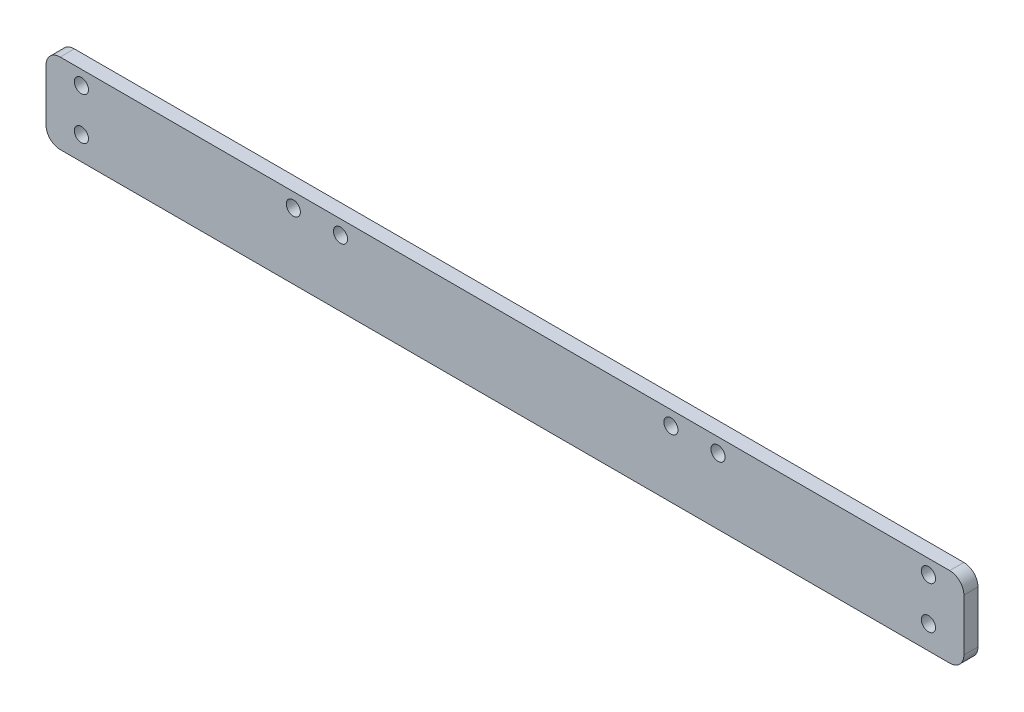
ISO-10303-21;
HEADER;
FILE_DESCRIPTION(('STEP AP214'),'2;1');
FILE_NAME('part.step','',(''),(''),'','','');
FILE_SCHEMA(('AUTOMOTIVE_DESIGN { 1 0 10303 214 1 1 1 1 }'));
ENDSEC;
DATA;
#1=APPLICATION_CONTEXT('core data for automotive mechanical design processes');
#2=APPLICATION_PROTOCOL_DEFINITION('international standard','automotive_design',2000,#1);
#3=PRODUCT_CONTEXT('',#1,'mechanical');
#4=PRODUCT('Part','Part','',(#3));
#5=PRODUCT_RELATED_PRODUCT_CATEGORY('part','',(#4));
#6=PRODUCT_DEFINITION_FORMATION('','',#4);
#7=PRODUCT_DEFINITION_CONTEXT('part definition',#1,'design');
#8=PRODUCT_DEFINITION('design','',#6,#7);
#9=PRODUCT_DEFINITION_SHAPE('','',#8);
#10=(LENGTH_UNIT() NAMED_UNIT(*) SI_UNIT(.MILLI.,.METRE.));
#11=(NAMED_UNIT(*) PLANE_ANGLE_UNIT() SI_UNIT($,.RADIAN.));
#12=(NAMED_UNIT(*) SI_UNIT($,.STERADIAN.) SOLID_ANGLE_UNIT());
#13=UNCERTAINTY_MEASURE_WITH_UNIT(LENGTH_MEASURE(1.E-05),#10,'distance_accuracy_value','');
#14=(GEOMETRIC_REPRESENTATION_CONTEXT(3) GLOBAL_UNCERTAINTY_ASSIGNED_CONTEXT((#13)) GLOBAL_UNIT_ASSIGNED_CONTEXT((#10,
#11,#12)) REPRESENTATION_CONTEXT('',''));
#15=CARTESIAN_POINT('',(0.,0.,0.));
#16=DIRECTION('',(0.,0.,1.));
#17=DIRECTION('',(1.,0.,0.));
#18=AXIS2_PLACEMENT_3D('',#15,#16,#17);
#19=CARTESIAN_POINT('',(97.3,-8.5,3.));
#20=DIRECTION('',(-1.,0.,0.));
#21=DIRECTION('',(0.,0.,1.));
#22=AXIS2_PLACEMENT_3D('',#19,#20,#21);
#23=PLANE('',#22);
#24=DIRECTION('',(0.,1.,0.));
#25=VECTOR('',#24,1.);
#26=CARTESIAN_POINT('',(97.3,-8.5,3.));
#27=LINE('',#26,#25);
#28=CARTESIAN_POINT('',(97.3,-5.5,3.));
#29=VERTEX_POINT('',#28);
#30=CARTESIAN_POINT('',(97.3,5.50000000000001,3.));
#31=VERTEX_POINT('',#30);
#32=EDGE_CURVE('E127',#29,#31,#27,.T.);
#33=ORIENTED_EDGE('',*,*,#32,.F.);
#34=DIRECTION('',(0.,0.,-1.));
#35=VECTOR('',#34,1.);
#36=CARTESIAN_POINT('',(97.3,-5.5,3.));
#37=LINE('',#36,#35);
#38=CARTESIAN_POINT('',(97.3,-5.5,0.));
#39=VERTEX_POINT('',#38);
#40=EDGE_CURVE('E112',#29,#39,#37,.T.);
#41=ORIENTED_EDGE('',*,*,#40,.T.);
#42=DIRECTION('',(0.,1.,0.));
#43=VECTOR('',#42,1.);
#44=CARTESIAN_POINT('',(97.3,-8.5,0.));
#45=LINE('',#44,#43);
#46=CARTESIAN_POINT('',(97.3,5.50000000000001,0.));
#47=VERTEX_POINT('',#46);
#48=EDGE_CURVE('E124',#39,#47,#45,.T.);
#49=ORIENTED_EDGE('',*,*,#48,.T.);
#50=DIRECTION('',(0.,0.,-1.));
#51=VECTOR('',#50,1.);
#52=CARTESIAN_POINT('',(97.3,5.50000000000001,3.));
#53=LINE('',#52,#51);
#54=EDGE_CURVE('E129',#47,#31,#53,.F.);
#55=ORIENTED_EDGE('',*,*,#54,.T.);
#56=EDGE_LOOP('',(#33,#41,#49,#55));
#57=FACE_BOUND('',#56,.T.);
#58=ADVANCED_FACE('F43',(#57),#23,.F.);
#59=CARTESIAN_POINT('',(-97.3,8.5,3.));
#60=DIRECTION('',(0.,-1.,0.));
#61=DIRECTION('',(0.,0.,-1.));
#62=AXIS2_PLACEMENT_3D('',#59,#60,#61);
#63=PLANE('',#62);
#64=DIRECTION('',(-1.,0.,0.));
#65=VECTOR('',#64,1.);
#66=CARTESIAN_POINT('',(-97.3,8.5,3.));
#67=LINE('',#66,#65);
#68=CARTESIAN_POINT('',(94.3,8.5,3.));
#69=VERTEX_POINT('',#68);
#70=CARTESIAN_POINT('',(-94.3,8.5,3.));
#71=VERTEX_POINT('',#70);
#72=EDGE_CURVE('E182',#69,#71,#67,.T.);
#73=ORIENTED_EDGE('',*,*,#72,.F.);
#74=DIRECTION('',(0.,0.,-1.));
#75=VECTOR('',#74,1.);
#76=CARTESIAN_POINT('',(94.3,8.5,3.));
#77=LINE('',#76,#75);
#78=CARTESIAN_POINT('',(94.3,8.5,0.));
#79=VERTEX_POINT('',#78);
#80=EDGE_CURVE('E166',#69,#79,#77,.T.);
#81=ORIENTED_EDGE('',*,*,#80,.T.);
#82=DIRECTION('',(-1.,0.,0.));
#83=VECTOR('',#82,1.);
#84=CARTESIAN_POINT('',(-97.3,8.5,0.));
#85=LINE('',#84,#83);
#86=CARTESIAN_POINT('',(-94.3,8.5,0.));
#87=VERTEX_POINT('',#86);
#88=EDGE_CURVE('E133',#79,#87,#85,.T.);
#89=ORIENTED_EDGE('',*,*,#88,.T.);
#90=DIRECTION('',(0.,0.,-1.));
#91=VECTOR('',#90,1.);
#92=CARTESIAN_POINT('',(-94.3,8.5,3.));
#93=LINE('',#92,#91);
#94=EDGE_CURVE('E164',#87,#71,#93,.F.);
#95=ORIENTED_EDGE('',*,*,#94,.T.);
#96=EDGE_LOOP('',(#73,#81,#89,#95));
#97=FACE_BOUND('',#96,.T.);
#98=ADVANCED_FACE('F273',(#97),#63,.F.);
#99=CARTESIAN_POINT('',(-97.3,-8.5,3.));
#100=DIRECTION('',(1.,0.,0.));
#101=DIRECTION('',(0.,0.,-1.));
#102=AXIS2_PLACEMENT_3D('',#99,#100,#101);
#103=PLANE('',#102);
#104=DIRECTION('',(0.,-1.,0.));
#105=VECTOR('',#104,1.);
#106=CARTESIAN_POINT('',(-97.3,-8.5,0.));
#107=LINE('',#106,#105);
#108=CARTESIAN_POINT('',(-97.3,5.50000000000001,0.));
#109=VERTEX_POINT('',#108);
#110=CARTESIAN_POINT('',(-97.3,-5.5,0.));
#111=VERTEX_POINT('',#110);
#112=EDGE_CURVE('E137',#109,#111,#107,.T.);
#113=ORIENTED_EDGE('',*,*,#112,.T.);
#114=DIRECTION('',(0.,0.,-1.));
#115=VECTOR('',#114,1.);
#116=CARTESIAN_POINT('',(-97.3,-5.5,3.));
#117=LINE('',#116,#115);
#118=CARTESIAN_POINT('',(-97.3,-5.5,3.));
#119=VERTEX_POINT('',#118);
#120=EDGE_CURVE('E11',#111,#119,#117,.F.);
#121=ORIENTED_EDGE('',*,*,#120,.T.);
#122=DIRECTION('',(0.,-1.,0.));
#123=VECTOR('',#122,1.);
#124=CARTESIAN_POINT('',(-97.3,-8.5,3.));
#125=LINE('',#124,#123);
#126=CARTESIAN_POINT('',(-97.3,5.50000000000001,3.));
#127=VERTEX_POINT('',#126);
#128=EDGE_CURVE('E172',#127,#119,#125,.T.);
#129=ORIENTED_EDGE('',*,*,#128,.F.);
#130=DIRECTION('',(0.,0.,-1.));
#131=VECTOR('',#130,1.);
#132=CARTESIAN_POINT('',(-97.3,5.50000000000001,3.));
#133=LINE('',#132,#131);
#134=EDGE_CURVE('E51',#127,#109,#133,.T.);
#135=ORIENTED_EDGE('',*,*,#134,.T.);
#136=EDGE_LOOP('',(#113,#121,#129,#135));
#137=FACE_BOUND('',#136,.T.);
#138=ADVANCED_FACE('F171',(#137),#103,.F.);
#139=CARTESIAN_POINT('',(-97.3,-8.5,3.));
#140=DIRECTION('',(0.,1.,0.));
#141=DIRECTION('',(0.,0.,1.));
#142=AXIS2_PLACEMENT_3D('',#139,#140,#141);
#143=PLANE('',#142);
#144=DIRECTION('',(1.,0.,0.));
#145=VECTOR('',#144,1.);
#146=CARTESIAN_POINT('',(-97.3,-8.5,0.));
#147=LINE('',#146,#145);
#148=CARTESIAN_POINT('',(-94.3,-8.5,0.));
#149=VERTEX_POINT('',#148);
#150=CARTESIAN_POINT('',(94.3,-8.5,0.));
#151=VERTEX_POINT('',#150);
#152=EDGE_CURVE('E147',#149,#151,#147,.T.);
#153=ORIENTED_EDGE('',*,*,#152,.T.);
#154=DIRECTION('',(0.,0.,-1.));
#155=VECTOR('',#154,1.);
#156=CARTESIAN_POINT('',(94.3,-8.5,3.));
#157=LINE('',#156,#155);
#158=CARTESIAN_POINT('',(94.3,-8.5,3.));
#159=VERTEX_POINT('',#158);
#160=EDGE_CURVE('E113',#151,#159,#157,.F.);
#161=ORIENTED_EDGE('',*,*,#160,.T.);
#162=DIRECTION('',(1.,0.,0.));
#163=VECTOR('',#162,1.);
#164=CARTESIAN_POINT('',(-97.3,-8.5,3.));
#165=LINE('',#164,#163);
#166=CARTESIAN_POINT('',(-94.3,-8.5,3.));
#167=VERTEX_POINT('',#166);
#168=EDGE_CURVE('E143',#167,#159,#165,.T.);
#169=ORIENTED_EDGE('',*,*,#168,.F.);
#170=DIRECTION('',(0.,0.,-1.));
#171=VECTOR('',#170,1.);
#172=CARTESIAN_POINT('',(-94.3,-8.5,3.));
#173=LINE('',#172,#171);
#174=EDGE_CURVE('E118',#167,#149,#173,.T.);
#175=ORIENTED_EDGE('',*,*,#174,.T.);
#176=EDGE_LOOP('',(#153,#161,#169,#175));
#177=FACE_BOUND('',#176,.T.);
#178=ADVANCED_FACE('F180',(#177),#143,.F.);
#179=CARTESIAN_POINT('',(0.,0.,3.));
#180=DIRECTION('',(0.,0.,-1.));
#181=DIRECTION('',(-1.,0.,0.));
#182=AXIS2_PLACEMENT_3D('',#179,#180,#181);
#183=PLANE('',#182);
#184=CARTESIAN_POINT('',(45.188251481114,5.49999999999941,3.));
#185=DIRECTION('',(0.,0.,-1.));
#186=DIRECTION('',(-1.,0.,0.));
#187=AXIS2_PLACEMENT_3D('',#184,#185,#186);
#188=CIRCLE('',#187,1.5);
#189=CARTESIAN_POINT('',(43.688251481114,5.49999999999941,3.));
#190=VERTEX_POINT('',#189);
#191=EDGE_CURVE('E211',#190,#190,#188,.T.);
#192=ORIENTED_EDGE('',*,*,#191,.T.);
#193=EDGE_LOOP('',(#192));
#194=FACE_BOUND('',#193,.T.);
#195=CARTESIAN_POINT('',(35.188251481114,5.49999999999937,3.));
#196=DIRECTION('',(0.,0.,-1.));
#197=DIRECTION('',(-1.,0.,0.));
#198=AXIS2_PLACEMENT_3D('',#195,#196,#197);
#199=CIRCLE('',#198,1.5);
#200=CARTESIAN_POINT('',(33.688251481114,5.49999999999937,3.));
#201=VERTEX_POINT('',#200);
#202=EDGE_CURVE('E219',#201,#201,#199,.T.);
#203=ORIENTED_EDGE('',*,*,#202,.T.);
#204=EDGE_LOOP('',(#203));
#205=FACE_BOUND('',#204,.T.);
#206=CARTESIAN_POINT('',(-44.8638429329677,5.4999999998517,3.));
#207=DIRECTION('',(0.,0.,-1.));
#208=DIRECTION('',(-1.,0.,0.));
#209=AXIS2_PLACEMENT_3D('',#206,#207,#208);
#210=CIRCLE('',#209,1.5);
#211=CARTESIAN_POINT('',(-46.3638429329677,5.4999999998517,3.));
#212=VERTEX_POINT('',#211);
#213=EDGE_CURVE('E193',#212,#212,#210,.T.);
#214=ORIENTED_EDGE('',*,*,#213,.T.);
#215=EDGE_LOOP('',(#214));
#216=FACE_BOUND('',#215,.T.);
#217=CARTESIAN_POINT('',(-34.8638429329677,5.49999999985175,3.));
#218=DIRECTION('',(0.,0.,-1.));
#219=DIRECTION('',(-1.,0.,0.));
#220=AXIS2_PLACEMENT_3D('',#217,#218,#219);
#221=CIRCLE('',#220,1.5);
#222=CARTESIAN_POINT('',(-36.3638429329677,5.49999999985175,3.));
#223=VERTEX_POINT('',#222);
#224=EDGE_CURVE('E207',#223,#223,#221,.T.);
#225=ORIENTED_EDGE('',*,*,#224,.T.);
#226=EDGE_LOOP('',(#225));
#227=FACE_BOUND('',#226,.T.);
#228=CARTESIAN_POINT('',(-89.8000000000014,5.49999999999971,3.));
#229=DIRECTION('',(0.,0.,1.));
#230=DIRECTION('',(1.,0.,0.));
#231=AXIS2_PLACEMENT_3D('',#228,#229,#230);
#232=CIRCLE('',#231,1.5);
#233=CARTESIAN_POINT('',(-88.3000000000014,5.49999999999971,3.));
#234=VERTEX_POINT('',#233);
#235=EDGE_CURVE('E192',#234,#234,#232,.T.);
#236=ORIENTED_EDGE('',*,*,#235,.F.);
#237=EDGE_LOOP('',(#236));
#238=FACE_BOUND('',#237,.T.);
#239=CARTESIAN_POINT('',(-89.8000000000014,-3.50000000000028,3.));
#240=DIRECTION('',(0.,0.,1.));
#241=DIRECTION('',(1.,0.,0.));
#242=AXIS2_PLACEMENT_3D('',#239,#240,#241);
#243=CIRCLE('',#242,1.5);
#244=CARTESIAN_POINT('',(-88.3000000000014,-3.50000000000028,3.));
#245=VERTEX_POINT('',#244);
#246=EDGE_CURVE('E199',#245,#245,#243,.T.);
#247=ORIENTED_EDGE('',*,*,#246,.F.);
#248=EDGE_LOOP('',(#247));
#249=FACE_BOUND('',#248,.T.);
#250=CARTESIAN_POINT('',(89.8002134006629,-3.49999999999918,3.));
#251=DIRECTION('',(0.,0.,1.));
#252=DIRECTION('',(1.,0.,0.));
#253=AXIS2_PLACEMENT_3D('',#250,#251,#252);
#254=CIRCLE('',#253,1.5);
#255=CARTESIAN_POINT('',(91.3002134006629,-3.49999999999918,3.));
#256=VERTEX_POINT('',#255);
#257=EDGE_CURVE('E187',#256,#256,#254,.T.);
#258=ORIENTED_EDGE('',*,*,#257,.F.);
#259=EDGE_LOOP('',(#258));
#260=FACE_BOUND('',#259,.T.);
#261=CARTESIAN_POINT('',(89.8002134006629,5.50000000000081,3.));
#262=DIRECTION('',(0.,0.,1.));
#263=DIRECTION('',(1.,0.,0.));
#264=AXIS2_PLACEMENT_3D('',#261,#262,#263);
#265=CIRCLE('',#264,1.5);
#266=CARTESIAN_POINT('',(91.3002134006629,5.50000000000081,3.));
#267=VERTEX_POINT('',#266);
#268=EDGE_CURVE('E140',#267,#267,#265,.T.);
#269=ORIENTED_EDGE('',*,*,#268,.F.);
#270=EDGE_LOOP('',(#269));
#271=FACE_BOUND('',#270,.T.);
#272=ORIENTED_EDGE('',*,*,#168,.T.);
#273=CARTESIAN_POINT('',(94.3,-5.5,3.));
#274=DIRECTION('',(0.,0.,-1.));
#275=DIRECTION('',(-1.,0.,0.));
#276=AXIS2_PLACEMENT_3D('',#273,#274,#275);
#277=CIRCLE('',#276,3.);
#278=EDGE_CURVE('E162',#159,#29,#277,.F.);
#279=ORIENTED_EDGE('',*,*,#278,.T.);
#280=ORIENTED_EDGE('',*,*,#32,.T.);
#281=CARTESIAN_POINT('',(94.3,5.5,3.));
#282=DIRECTION('',(0.,0.,-1.));
#283=DIRECTION('',(-1.,0.,0.));
#284=AXIS2_PLACEMENT_3D('',#281,#282,#283);
#285=CIRCLE('',#284,3.);
#286=EDGE_CURVE('E160',#31,#69,#285,.F.);
#287=ORIENTED_EDGE('',*,*,#286,.T.);
#288=ORIENTED_EDGE('',*,*,#72,.T.);
#289=CARTESIAN_POINT('',(-94.3,5.50000000000001,3.));
#290=DIRECTION('',(0.,0.,-1.));
#291=DIRECTION('',(-1.,0.,0.));
#292=AXIS2_PLACEMENT_3D('',#289,#290,#291);
#293=CIRCLE('',#292,3.);
#294=EDGE_CURVE('E63',#71,#127,#293,.F.);
#295=ORIENTED_EDGE('',*,*,#294,.T.);
#296=ORIENTED_EDGE('',*,*,#128,.T.);
#297=CARTESIAN_POINT('',(-94.3,-5.5,3.));
#298=DIRECTION('',(0.,0.,-1.));
#299=DIRECTION('',(-1.,0.,0.));
#300=AXIS2_PLACEMENT_3D('',#297,#298,#299);
#301=CIRCLE('',#300,3.);
#302=EDGE_CURVE('E158',#119,#167,#301,.F.);
#303=ORIENTED_EDGE('',*,*,#302,.T.);
#304=EDGE_LOOP('',(#272,#279,#280,#287,#288,#295,#296,#303));
#305=FACE_BOUND('',#304,.T.);
#306=ADVANCED_FACE('F231',(#194,#205,#216,#227,#238,#249,#260,#271,#305),#183,.F.);
#307=CARTESIAN_POINT('',(0.,0.,0.));
#308=DIRECTION('',(0.,0.,-1.));
#309=DIRECTION('',(-1.,0.,0.));
#310=AXIS2_PLACEMENT_3D('',#307,#308,#309);
#311=PLANE('',#310);
#312=CARTESIAN_POINT('',(45.188251481114,5.49999999999941,0.));
#313=DIRECTION('',(0.,0.,-1.));
#314=DIRECTION('',(-1.,0.,0.));
#315=AXIS2_PLACEMENT_3D('',#312,#313,#314);
#316=CIRCLE('',#315,1.5);
#317=CARTESIAN_POINT('',(43.688251481114,5.49999999999941,0.));
#318=VERTEX_POINT('',#317);
#319=EDGE_CURVE('E225',#318,#318,#316,.T.);
#320=ORIENTED_EDGE('',*,*,#319,.F.);
#321=EDGE_LOOP('',(#320));
#322=FACE_BOUND('',#321,.T.);
#323=CARTESIAN_POINT('',(35.188251481114,5.49999999999937,0.));
#324=DIRECTION('',(0.,0.,-1.));
#325=DIRECTION('',(-1.,0.,0.));
#326=AXIS2_PLACEMENT_3D('',#323,#324,#325);
#327=CIRCLE('',#326,1.5);
#328=CARTESIAN_POINT('',(33.688251481114,5.49999999999937,0.));
#329=VERTEX_POINT('',#328);
#330=EDGE_CURVE('E222',#329,#329,#327,.T.);
#331=ORIENTED_EDGE('',*,*,#330,.F.);
#332=EDGE_LOOP('',(#331));
#333=FACE_BOUND('',#332,.T.);
#334=CARTESIAN_POINT('',(-44.8638429329677,5.4999999998517,0.));
#335=DIRECTION('',(0.,0.,-1.));
#336=DIRECTION('',(-1.,0.,0.));
#337=AXIS2_PLACEMENT_3D('',#334,#335,#336);
#338=CIRCLE('',#337,1.5);
#339=CARTESIAN_POINT('',(-46.3638429329677,5.4999999998517,0.));
#340=VERTEX_POINT('',#339);
#341=EDGE_CURVE('E214',#340,#340,#338,.T.);
#342=ORIENTED_EDGE('',*,*,#341,.F.);
#343=EDGE_LOOP('',(#342));
#344=FACE_BOUND('',#343,.T.);
#345=CARTESIAN_POINT('',(-34.8638429329677,5.49999999985175,0.));
#346=DIRECTION('',(0.,0.,-1.));
#347=DIRECTION('',(-1.,0.,0.));
#348=AXIS2_PLACEMENT_3D('',#345,#346,#347);
#349=CIRCLE('',#348,1.5);
#350=CARTESIAN_POINT('',(-36.3638429329677,5.49999999985175,0.));
#351=VERTEX_POINT('',#350);
#352=EDGE_CURVE('E210',#351,#351,#349,.T.);
#353=ORIENTED_EDGE('',*,*,#352,.F.);
#354=EDGE_LOOP('',(#353));
#355=FACE_BOUND('',#354,.T.);
#356=CARTESIAN_POINT('',(-89.8000000000014,5.49999999999971,0.));
#357=DIRECTION('',(0.,0.,1.));
#358=DIRECTION('',(1.,0.,0.));
#359=AXIS2_PLACEMENT_3D('',#356,#357,#358);
#360=CIRCLE('',#359,1.5);
#361=CARTESIAN_POINT('',(-88.3000000000014,5.49999999999971,0.));
#362=VERTEX_POINT('',#361);
#363=EDGE_CURVE('E189',#362,#362,#360,.T.);
#364=ORIENTED_EDGE('',*,*,#363,.T.);
#365=EDGE_LOOP('',(#364));
#366=FACE_BOUND('',#365,.T.);
#367=CARTESIAN_POINT('',(-89.8000000000014,-3.50000000000028,0.));
#368=DIRECTION('',(0.,0.,1.));
#369=DIRECTION('',(1.,0.,0.));
#370=AXIS2_PLACEMENT_3D('',#367,#368,#369);
#371=CIRCLE('',#370,1.5);
#372=CARTESIAN_POINT('',(-88.3000000000014,-3.50000000000028,0.));
#373=VERTEX_POINT('',#372);
#374=EDGE_CURVE('E196',#373,#373,#371,.T.);
#375=ORIENTED_EDGE('',*,*,#374,.T.);
#376=EDGE_LOOP('',(#375));
#377=FACE_BOUND('',#376,.T.);
#378=CARTESIAN_POINT('',(89.8002134006629,-3.49999999999918,0.));
#379=DIRECTION('',(0.,0.,1.));
#380=DIRECTION('',(1.,0.,0.));
#381=AXIS2_PLACEMENT_3D('',#378,#379,#380);
#382=CIRCLE('',#381,1.5);
#383=CARTESIAN_POINT('',(91.3002134006629,-3.49999999999918,0.));
#384=VERTEX_POINT('',#383);
#385=EDGE_CURVE('E202',#384,#384,#382,.T.);
#386=ORIENTED_EDGE('',*,*,#385,.T.);
#387=EDGE_LOOP('',(#386));
#388=FACE_BOUND('',#387,.T.);
#389=CARTESIAN_POINT('',(89.8002134006629,5.50000000000081,0.));
#390=DIRECTION('',(0.,0.,1.));
#391=DIRECTION('',(1.,0.,0.));
#392=AXIS2_PLACEMENT_3D('',#389,#390,#391);
#393=CIRCLE('',#392,1.5);
#394=CARTESIAN_POINT('',(91.3002134006629,5.50000000000081,0.));
#395=VERTEX_POINT('',#394);
#396=EDGE_CURVE('E134',#395,#395,#393,.T.);
#397=ORIENTED_EDGE('',*,*,#396,.T.);
#398=EDGE_LOOP('',(#397));
#399=FACE_BOUND('',#398,.T.);
#400=ORIENTED_EDGE('',*,*,#48,.F.);
#401=CARTESIAN_POINT('',(94.3,-5.5,0.));
#402=DIRECTION('',(0.,0.,-1.));
#403=DIRECTION('',(-1.,0.,0.));
#404=AXIS2_PLACEMENT_3D('',#401,#402,#403);
#405=CIRCLE('',#404,3.);
#406=EDGE_CURVE('E108',#39,#151,#405,.T.);
#407=ORIENTED_EDGE('',*,*,#406,.T.);
#408=ORIENTED_EDGE('',*,*,#152,.F.);
#409=CARTESIAN_POINT('',(-94.3,-5.5,0.));
#410=DIRECTION('',(0.,0.,-1.));
#411=DIRECTION('',(-1.,0.,0.));
#412=AXIS2_PLACEMENT_3D('',#409,#410,#411);
#413=CIRCLE('',#412,3.);
#414=EDGE_CURVE('E151',#149,#111,#413,.T.);
#415=ORIENTED_EDGE('',*,*,#414,.T.);
#416=ORIENTED_EDGE('',*,*,#112,.F.);
#417=CARTESIAN_POINT('',(-94.3,5.50000000000001,0.));
#418=DIRECTION('',(0.,0.,-1.));
#419=DIRECTION('',(-1.,0.,0.));
#420=AXIS2_PLACEMENT_3D('',#417,#418,#419);
#421=CIRCLE('',#420,3.);
#422=EDGE_CURVE('E128',#109,#87,#421,.T.);
#423=ORIENTED_EDGE('',*,*,#422,.T.);
#424=ORIENTED_EDGE('',*,*,#88,.F.);
#425=CARTESIAN_POINT('',(94.3,5.5,0.));
#426=DIRECTION('',(0.,0.,-1.));
#427=DIRECTION('',(-1.,0.,0.));
#428=AXIS2_PLACEMENT_3D('',#425,#426,#427);
#429=CIRCLE('',#428,3.);
#430=EDGE_CURVE('E119',#79,#47,#429,.T.);
#431=ORIENTED_EDGE('',*,*,#430,.T.);
#432=EDGE_LOOP('',(#400,#407,#408,#415,#416,#423,#424,#431));
#433=FACE_BOUND('',#432,.T.);
#434=ADVANCED_FACE('F131',(#322,#333,#344,#355,#366,#377,#388,#399,#433),#311,.T.);
#435=CARTESIAN_POINT('',(94.3,-5.5,3.));
#436=DIRECTION('',(0.,0.,-1.));
#437=DIRECTION('',(-1.,0.,0.));
#438=AXIS2_PLACEMENT_3D('',#435,#436,#437);
#439=CYLINDRICAL_SURFACE('',#438,3.);
#440=ORIENTED_EDGE('',*,*,#278,.F.);
#441=ORIENTED_EDGE('',*,*,#160,.F.);
#442=ORIENTED_EDGE('',*,*,#406,.F.);
#443=ORIENTED_EDGE('',*,*,#40,.F.);
#444=EDGE_LOOP('',(#440,#441,#442,#443));
#445=FACE_BOUND('',#444,.T.);
#446=ADVANCED_FACE('F111',(#445),#439,.T.);
#447=CARTESIAN_POINT('',(94.3,5.5,3.));
#448=DIRECTION('',(0.,0.,-1.));
#449=DIRECTION('',(-1.,0.,0.));
#450=AXIS2_PLACEMENT_3D('',#447,#448,#449);
#451=CYLINDRICAL_SURFACE('',#450,3.);
#452=ORIENTED_EDGE('',*,*,#286,.F.);
#453=ORIENTED_EDGE('',*,*,#54,.F.);
#454=ORIENTED_EDGE('',*,*,#430,.F.);
#455=ORIENTED_EDGE('',*,*,#80,.F.);
#456=EDGE_LOOP('',(#452,#453,#454,#455));
#457=FACE_BOUND('',#456,.T.);
#458=ADVANCED_FACE('F284',(#457),#451,.T.);
#459=CARTESIAN_POINT('',(-94.3,-5.5,3.));
#460=DIRECTION('',(0.,0.,-1.));
#461=DIRECTION('',(-1.,0.,0.));
#462=AXIS2_PLACEMENT_3D('',#459,#460,#461);
#463=CYLINDRICAL_SURFACE('',#462,3.);
#464=ORIENTED_EDGE('',*,*,#302,.F.);
#465=ORIENTED_EDGE('',*,*,#120,.F.);
#466=ORIENTED_EDGE('',*,*,#414,.F.);
#467=ORIENTED_EDGE('',*,*,#174,.F.);
#468=EDGE_LOOP('',(#464,#465,#466,#467));
#469=FACE_BOUND('',#468,.T.);
#470=ADVANCED_FACE('F177',(#469),#463,.T.);
#471=CARTESIAN_POINT('',(-94.3,5.50000000000001,3.));
#472=DIRECTION('',(0.,0.,-1.));
#473=DIRECTION('',(-1.,0.,0.));
#474=AXIS2_PLACEMENT_3D('',#471,#472,#473);
#475=CYLINDRICAL_SURFACE('',#474,3.);
#476=ORIENTED_EDGE('',*,*,#294,.F.);
#477=ORIENTED_EDGE('',*,*,#94,.F.);
#478=ORIENTED_EDGE('',*,*,#422,.F.);
#479=ORIENTED_EDGE('',*,*,#134,.F.);
#480=EDGE_LOOP('',(#476,#477,#478,#479));
#481=FACE_BOUND('',#480,.T.);
#482=ADVANCED_FACE('F45',(#481),#475,.T.);
#483=CARTESIAN_POINT('',(89.8002134006629,5.50000000000081,0.));
#484=DIRECTION('',(0.,0.,1.));
#485=DIRECTION('',(1.,0.,0.));
#486=AXIS2_PLACEMENT_3D('',#483,#484,#485);
#487=CYLINDRICAL_SURFACE('',#486,1.5);
#488=ORIENTED_EDGE('',*,*,#396,.F.);
#489=EDGE_LOOP('',(#488));
#490=FACE_BOUND('',#489,.T.);
#491=ORIENTED_EDGE('',*,*,#268,.T.);
#492=EDGE_LOOP('',(#491));
#493=FACE_BOUND('',#492,.T.);
#494=ADVANCED_FACE('F258',(#490,#493),#487,.F.);
#495=CARTESIAN_POINT('',(89.8002134006629,-3.49999999999918,0.));
#496=DIRECTION('',(0.,0.,1.));
#497=DIRECTION('',(1.,0.,0.));
#498=AXIS2_PLACEMENT_3D('',#495,#496,#497);
#499=CYLINDRICAL_SURFACE('',#498,1.5);
#500=ORIENTED_EDGE('',*,*,#385,.F.);
#501=EDGE_LOOP('',(#500));
#502=FACE_BOUND('',#501,.T.);
#503=ORIENTED_EDGE('',*,*,#257,.T.);
#504=EDGE_LOOP('',(#503));
#505=FACE_BOUND('',#504,.T.);
#506=ADVANCED_FACE('F261',(#502,#505),#499,.F.);
#507=CARTESIAN_POINT('',(-89.8000000000014,-3.50000000000028,0.));
#508=DIRECTION('',(0.,0.,1.));
#509=DIRECTION('',(1.,0.,0.));
#510=AXIS2_PLACEMENT_3D('',#507,#508,#509);
#511=CYLINDRICAL_SURFACE('',#510,1.5);
#512=ORIENTED_EDGE('',*,*,#374,.F.);
#513=EDGE_LOOP('',(#512));
#514=FACE_BOUND('',#513,.T.);
#515=ORIENTED_EDGE('',*,*,#246,.T.);
#516=EDGE_LOOP('',(#515));
#517=FACE_BOUND('',#516,.T.);
#518=ADVANCED_FACE('F309',(#514,#517),#511,.F.);
#519=CARTESIAN_POINT('',(-89.8000000000014,5.49999999999971,0.));
#520=DIRECTION('',(0.,0.,1.));
#521=DIRECTION('',(1.,0.,0.));
#522=AXIS2_PLACEMENT_3D('',#519,#520,#521);
#523=CYLINDRICAL_SURFACE('',#522,1.5);
#524=ORIENTED_EDGE('',*,*,#363,.F.);
#525=EDGE_LOOP('',(#524));
#526=FACE_BOUND('',#525,.T.);
#527=ORIENTED_EDGE('',*,*,#235,.T.);
#528=EDGE_LOOP('',(#527));
#529=FACE_BOUND('',#528,.T.);
#530=ADVANCED_FACE('F318',(#526,#529),#523,.F.);
#531=CARTESIAN_POINT('',(-34.8638429329677,5.49999999985175,3.));
#532=DIRECTION('',(0.,0.,-1.));
#533=DIRECTION('',(-1.,0.,0.));
#534=AXIS2_PLACEMENT_3D('',#531,#532,#533);
#535=CYLINDRICAL_SURFACE('',#534,1.5);
#536=ORIENTED_EDGE('',*,*,#224,.F.);
#537=EDGE_LOOP('',(#536));
#538=FACE_BOUND('',#537,.T.);
#539=ORIENTED_EDGE('',*,*,#352,.T.);
#540=EDGE_LOOP('',(#539));
#541=FACE_BOUND('',#540,.T.);
#542=ADVANCED_FACE('F327',(#538,#541),#535,.F.);
#543=CARTESIAN_POINT('',(-44.8638429329677,5.4999999998517,3.));
#544=DIRECTION('',(0.,0.,-1.));
#545=DIRECTION('',(-1.,0.,0.));
#546=AXIS2_PLACEMENT_3D('',#543,#544,#545);
#547=CYLINDRICAL_SURFACE('',#546,1.5);
#548=ORIENTED_EDGE('',*,*,#213,.F.);
#549=EDGE_LOOP('',(#548));
#550=FACE_BOUND('',#549,.T.);
#551=ORIENTED_EDGE('',*,*,#341,.T.);
#552=EDGE_LOOP('',(#551));
#553=FACE_BOUND('',#552,.T.);
#554=ADVANCED_FACE('F335',(#550,#553),#547,.F.);
#555=CARTESIAN_POINT('',(35.188251481114,5.49999999999937,3.));
#556=DIRECTION('',(0.,0.,-1.));
#557=DIRECTION('',(-1.,0.,0.));
#558=AXIS2_PLACEMENT_3D('',#555,#556,#557);
#559=CYLINDRICAL_SURFACE('',#558,1.5);
#560=ORIENTED_EDGE('',*,*,#202,.F.);
#561=EDGE_LOOP('',(#560));
#562=FACE_BOUND('',#561,.T.);
#563=ORIENTED_EDGE('',*,*,#330,.T.);
#564=EDGE_LOOP('',(#563));
#565=FACE_BOUND('',#564,.T.);
#566=ADVANCED_FACE('F237',(#562,#565),#559,.F.);
#567=CARTESIAN_POINT('',(45.188251481114,5.49999999999941,3.));
#568=DIRECTION('',(0.,0.,-1.));
#569=DIRECTION('',(-1.,0.,0.));
#570=AXIS2_PLACEMENT_3D('',#567,#568,#569);
#571=CYLINDRICAL_SURFACE('',#570,1.5);
#572=ORIENTED_EDGE('',*,*,#191,.F.);
#573=EDGE_LOOP('',(#572));
#574=FACE_BOUND('',#573,.T.);
#575=ORIENTED_EDGE('',*,*,#319,.T.);
#576=EDGE_LOOP('',(#575));
#577=FACE_BOUND('',#576,.T.);
#578=ADVANCED_FACE('F234',(#574,#577),#571,.F.);
#579=CLOSED_SHELL('',(#58,#98,#138,#178,#306,#434,#446,#458,#470,#482,#494,#506,#518,#530,#542,
#554,#566,#578));
#580=MANIFOLD_SOLID_BREP('B2',#579);
#581=ADVANCED_BREP_SHAPE_REPRESENTATION('',(#18,#580),#14);
#582=SHAPE_DEFINITION_REPRESENTATION(#9,#581);
ENDSEC;
END-ISO-10303-21;
